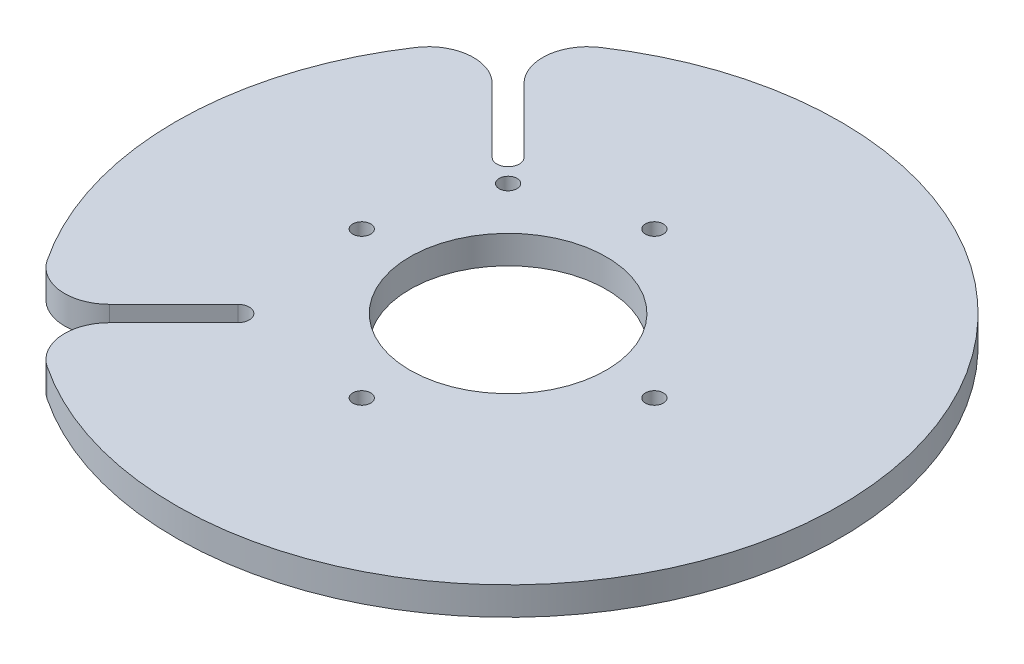
ISO-10303-21;
HEADER;
FILE_DESCRIPTION(('STEP AP214'),'2;1');
FILE_NAME('part.step','',(''),(''),'','','');
FILE_SCHEMA(('AUTOMOTIVE_DESIGN { 1 0 10303 214 1 1 1 1 }'));
ENDSEC;
DATA;
#1=APPLICATION_CONTEXT('core data for automotive mechanical design processes');
#2=APPLICATION_PROTOCOL_DEFINITION('international standard','automotive_design',2000,#1);
#3=PRODUCT_CONTEXT('',#1,'mechanical');
#4=PRODUCT('Part','Part','',(#3));
#5=PRODUCT_RELATED_PRODUCT_CATEGORY('part','',(#4));
#6=PRODUCT_DEFINITION_FORMATION('','',#4);
#7=PRODUCT_DEFINITION_CONTEXT('part definition',#1,'design');
#8=PRODUCT_DEFINITION('design','',#6,#7);
#9=PRODUCT_DEFINITION_SHAPE('','',#8);
#10=(LENGTH_UNIT() NAMED_UNIT(*) SI_UNIT(.MILLI.,.METRE.));
#11=(NAMED_UNIT(*) PLANE_ANGLE_UNIT() SI_UNIT($,.RADIAN.));
#12=(NAMED_UNIT(*) SI_UNIT($,.STERADIAN.) SOLID_ANGLE_UNIT());
#13=UNCERTAINTY_MEASURE_WITH_UNIT(LENGTH_MEASURE(1.E-05),#10,'distance_accuracy_value','');
#14=(GEOMETRIC_REPRESENTATION_CONTEXT(3) GLOBAL_UNCERTAINTY_ASSIGNED_CONTEXT((#13)) GLOBAL_UNIT_ASSIGNED_CONTEXT((#10,
#11,#12)) REPRESENTATION_CONTEXT('',''));
#15=CARTESIAN_POINT('',(0.,0.,0.));
#16=DIRECTION('',(0.,0.,1.));
#17=DIRECTION('',(1.,0.,0.));
#18=AXIS2_PLACEMENT_3D('',#15,#16,#17);
#19=CARTESIAN_POINT('',(0.,6.35,0.));
#20=DIRECTION('',(0.,-1.,0.));
#21=DIRECTION('',(0.,0.,-1.));
#22=AXIS2_PLACEMENT_3D('',#19,#20,#21);
#23=CYLINDRICAL_SURFACE('',#22,75.);
#24=CARTESIAN_POINT('',(0.,6.35,0.));
#25=DIRECTION('',(0.,1.,0.));
#26=DIRECTION('',(0.,0.,1.));
#27=AXIS2_PLACEMENT_3D('',#24,#25,#26);
#28=CIRCLE('',#27,75.);
#29=CARTESIAN_POINT('',(-41.6183838096095,6.35,62.3931897651982));
#30=VERTEX_POINT('',#29);
#31=CARTESIAN_POINT('',(-41.6183838096095,6.35,-62.3931897651982));
#32=VERTEX_POINT('',#31);
#33=EDGE_CURVE('E207',#30,#32,#28,.T.);
#34=ORIENTED_EDGE('',*,*,#33,.F.);
#35=DIRECTION('',(0.,-1.,0.));
#36=VECTOR('',#35,1.);
#37=CARTESIAN_POINT('',(-41.6183838096095,6.35,62.3931897651982));
#38=LINE('',#37,#36);
#39=CARTESIAN_POINT('',(-41.6183838096095,0.,62.3931897651982));
#40=VERTEX_POINT('',#39);
#41=EDGE_CURVE('E224',#30,#40,#38,.T.);
#42=ORIENTED_EDGE('',*,*,#41,.T.);
#43=CARTESIAN_POINT('',(0.,0.,0.));
#44=DIRECTION('',(0.,1.,0.));
#45=DIRECTION('',(0.,0.,1.));
#46=AXIS2_PLACEMENT_3D('',#43,#44,#45);
#47=CIRCLE('',#46,75.);
#48=CARTESIAN_POINT('',(-41.6183838096095,0.,-62.3931897651982));
#49=VERTEX_POINT('',#48);
#50=EDGE_CURVE('E200',#40,#49,#47,.T.);
#51=ORIENTED_EDGE('',*,*,#50,.T.);
#52=DIRECTION('',(0.,-1.,0.));
#53=VECTOR('',#52,1.);
#54=CARTESIAN_POINT('',(-41.6183838096095,6.35,-62.3931897651982));
#55=LINE('',#54,#53);
#56=EDGE_CURVE('E221',#49,#32,#55,.F.);
#57=ORIENTED_EDGE('',*,*,#56,.T.);
#58=EDGE_LOOP('',(#34,#42,#51,#57));
#59=FACE_BOUND('',#58,.T.);
#60=ADVANCED_FACE('F35',(#59),#23,.T.);
#61=CARTESIAN_POINT('',(-62.3931897651982,0.,-41.6183838096095));
#62=VERTEX_POINT('',#61);
#63=CARTESIAN_POINT('',(-62.3931897651982,0.,41.6183838096095));
#64=VERTEX_POINT('',#63);
#65=EDGE_CURVE('E208',#62,#64,#47,.T.);
#66=ORIENTED_EDGE('',*,*,#65,.T.);
#67=DIRECTION('',(0.,-1.,0.));
#68=VECTOR('',#67,1.);
#69=CARTESIAN_POINT('',(-62.3931897651982,6.35,41.6183838096095));
#70=LINE('',#69,#68);
#71=CARTESIAN_POINT('',(-62.3931897651982,6.35,41.6183838096095));
#72=VERTEX_POINT('',#71);
#73=EDGE_CURVE('E235',#64,#72,#70,.F.);
#74=ORIENTED_EDGE('',*,*,#73,.T.);
#75=CARTESIAN_POINT('',(-62.3931897651982,6.35,-41.6183838096095));
#76=VERTEX_POINT('',#75);
#77=EDGE_CURVE('E203',#76,#72,#28,.T.);
#78=ORIENTED_EDGE('',*,*,#77,.F.);
#79=DIRECTION('',(0.,-1.,0.));
#80=VECTOR('',#79,1.);
#81=CARTESIAN_POINT('',(-62.3931897651982,6.35,-41.6183838096095));
#82=LINE('',#81,#80);
#83=EDGE_CURVE('E233',#76,#62,#82,.T.);
#84=ORIENTED_EDGE('',*,*,#83,.T.);
#85=EDGE_LOOP('',(#66,#74,#78,#84));
#86=FACE_BOUND('',#85,.T.);
#87=ADVANCED_FACE('F251',(#86),#23,.T.);
#88=CARTESIAN_POINT('',(0.,6.35,0.));
#89=DIRECTION('',(0.,1.,0.));
#90=DIRECTION('',(0.,0.,1.));
#91=AXIS2_PLACEMENT_3D('',#88,#89,#90);
#92=PLANE('',#91);
#93=DIRECTION('',(0.707106781186547,0.,-0.707106781186548));
#94=VECTOR('',#93,1.);
#95=CARTESIAN_POINT('',(-28.6839487757862,6.35,32.2760512242138));
#96=LINE('',#95,#94);
#97=CARTESIAN_POINT('',(-43.164684979723,6.35,46.7567874281507));
#98=VERTEX_POINT('',#97);
#99=CARTESIAN_POINT('',(-28.6839487757862,6.35,32.2760512242138));
#100=VERTEX_POINT('',#99);
#101=EDGE_CURVE('E161',#98,#100,#96,.T.);
#102=ORIENTED_EDGE('',*,*,#101,.F.);
#103=CARTESIAN_POINT('',(-35.9804800828677,6.35,53.940992325006));
#104=DIRECTION('',(0.,1.,0.));
#105=DIRECTION('',(0.,0.,1.));
#106=AXIS2_PLACEMENT_3D('',#103,#104,#105);
#107=CIRCLE('',#106,10.16);
#108=EDGE_CURVE('E219',#98,#30,#107,.T.);
#109=ORIENTED_EDGE('',*,*,#108,.T.);
#110=ORIENTED_EDGE('',*,*,#33,.T.);
#111=CARTESIAN_POINT('',(-35.9804800828677,6.35,-53.940992325006));
#112=DIRECTION('',(0.,1.,0.));
#113=DIRECTION('',(0.,0.,1.));
#114=AXIS2_PLACEMENT_3D('',#111,#112,#113);
#115=CIRCLE('',#114,10.16);
#116=CARTESIAN_POINT('',(-43.164684979723,6.35,-46.7567874281507));
#117=VERTEX_POINT('',#116);
#118=EDGE_CURVE('E215',#32,#117,#115,.T.);
#119=ORIENTED_EDGE('',*,*,#118,.T.);
#120=DIRECTION('',(-0.707106781186548,0.,-0.707106781186547));
#121=VECTOR('',#120,1.);
#122=CARTESIAN_POINT('',(-28.6839487757862,6.35,-32.2760512242138));
#123=LINE('',#122,#121);
#124=CARTESIAN_POINT('',(-28.6839487757862,6.35,-32.2760512242138));
#125=VERTEX_POINT('',#124);
#126=EDGE_CURVE('E146',#125,#117,#123,.T.);
#127=ORIENTED_EDGE('',*,*,#126,.F.);
#128=CARTESIAN_POINT('',(-30.48,6.35,-30.48));
#129=DIRECTION('',(0.,1.,0.));
#130=DIRECTION('',(0.,0.,1.));
#131=AXIS2_PLACEMENT_3D('',#128,#129,#130);
#132=CIRCLE('',#131,2.54);
#133=CARTESIAN_POINT('',(-32.2760512242138,6.35,-28.6839487757862));
#134=VERTEX_POINT('',#133);
#135=EDGE_CURVE('E132',#134,#125,#132,.T.);
#136=ORIENTED_EDGE('',*,*,#135,.F.);
#137=DIRECTION('',(0.707106781186547,0.,0.707106781186548));
#138=VECTOR('',#137,1.);
#139=CARTESIAN_POINT('',(-32.2760512242138,6.35,-28.6839487757862));
#140=LINE('',#139,#138);
#141=CARTESIAN_POINT('',(-46.7567874281507,6.35,-43.164684979723));
#142=VERTEX_POINT('',#141);
#143=EDGE_CURVE('E144',#142,#134,#140,.T.);
#144=ORIENTED_EDGE('',*,*,#143,.F.);
#145=CARTESIAN_POINT('',(-53.940992325006,6.35,-35.9804800828677));
#146=DIRECTION('',(0.,1.,0.));
#147=DIRECTION('',(0.,0.,1.));
#148=AXIS2_PLACEMENT_3D('',#145,#146,#147);
#149=CIRCLE('',#148,10.16);
#150=EDGE_CURVE('E213',#142,#76,#149,.T.);
#151=ORIENTED_EDGE('',*,*,#150,.T.);
#152=ORIENTED_EDGE('',*,*,#77,.T.);
#153=CARTESIAN_POINT('',(-53.940992325006,6.35,35.9804800828677));
#154=DIRECTION('',(0.,1.,0.));
#155=DIRECTION('',(0.,0.,1.));
#156=AXIS2_PLACEMENT_3D('',#153,#154,#155);
#157=CIRCLE('',#156,10.16);
#158=CARTESIAN_POINT('',(-46.7567874281507,6.35,43.164684979723));
#159=VERTEX_POINT('',#158);
#160=EDGE_CURVE('E217',#72,#159,#157,.T.);
#161=ORIENTED_EDGE('',*,*,#160,.T.);
#162=DIRECTION('',(-0.707106781186547,0.,0.707106781186548));
#163=VECTOR('',#162,1.);
#164=CARTESIAN_POINT('',(-32.2760512242138,6.35,28.6839487757862));
#165=LINE('',#164,#163);
#166=CARTESIAN_POINT('',(-32.2760512242138,6.35,28.6839487757862));
#167=VERTEX_POINT('',#166);
#168=EDGE_CURVE('E170',#167,#159,#165,.T.);
#169=ORIENTED_EDGE('',*,*,#168,.F.);
#170=CARTESIAN_POINT('',(-30.48,6.35,30.48));
#171=DIRECTION('',(0.,1.,0.));
#172=DIRECTION('',(0.,0.,1.));
#173=AXIS2_PLACEMENT_3D('',#170,#171,#172);
#174=CIRCLE('',#173,2.54);
#175=EDGE_CURVE('E167',#100,#167,#174,.T.);
#176=ORIENTED_EDGE('',*,*,#175,.F.);
#177=EDGE_LOOP('',(#102,#109,#110,#119,#127,#136,#144,#151,#152,#161,#169,#176));
#178=FACE_BOUND('',#177,.T.);
#179=CARTESIAN_POINT('',(-25.4,6.35,-25.4));
#180=DIRECTION('',(0.,1.,0.));
#181=DIRECTION('',(0.,0.,1.));
#182=AXIS2_PLACEMENT_3D('',#179,#180,#181);
#183=CIRCLE('',#182,2.0193);
#184=CARTESIAN_POINT('',(-25.4,6.35,-23.3807));
#185=VERTEX_POINT('',#184);
#186=EDGE_CURVE('E149',#185,#185,#183,.T.);
#187=ORIENTED_EDGE('',*,*,#186,.F.);
#188=EDGE_LOOP('',(#187));
#189=FACE_BOUND('',#188,.T.);
#190=CARTESIAN_POINT('',(33.02,6.35,0.));
#191=DIRECTION('',(0.,1.,0.));
#192=DIRECTION('',(0.,0.,1.));
#193=AXIS2_PLACEMENT_3D('',#190,#191,#192);
#194=CIRCLE('',#193,2.0193);
#195=CARTESIAN_POINT('',(33.02,6.35,2.0193));
#196=VERTEX_POINT('',#195);
#197=EDGE_CURVE('E476',#196,#196,#194,.T.);
#198=ORIENTED_EDGE('',*,*,#197,.F.);
#199=EDGE_LOOP('',(#198));
#200=FACE_BOUND('',#199,.T.);
#201=CARTESIAN_POINT('',(0.,6.35,33.02));
#202=DIRECTION('',(0.,1.,0.));
#203=DIRECTION('',(0.,0.,1.));
#204=AXIS2_PLACEMENT_3D('',#201,#202,#203);
#205=CIRCLE('',#204,2.0193);
#206=CARTESIAN_POINT('',(0.,6.35,35.0393));
#207=VERTEX_POINT('',#206);
#208=EDGE_CURVE('E193',#207,#207,#205,.T.);
#209=ORIENTED_EDGE('',*,*,#208,.F.);
#210=EDGE_LOOP('',(#209));
#211=FACE_BOUND('',#210,.T.);
#212=CARTESIAN_POINT('',(-33.02,6.35,0.));
#213=DIRECTION('',(0.,1.,0.));
#214=DIRECTION('',(0.,0.,1.));
#215=AXIS2_PLACEMENT_3D('',#212,#213,#214);
#216=CIRCLE('',#215,2.0193);
#217=CARTESIAN_POINT('',(-33.02,6.35,2.0193));
#218=VERTEX_POINT('',#217);
#219=EDGE_CURVE('E187',#218,#218,#216,.T.);
#220=ORIENTED_EDGE('',*,*,#219,.F.);
#221=EDGE_LOOP('',(#220));
#222=FACE_BOUND('',#221,.T.);
#223=CARTESIAN_POINT('',(0.,6.35,-33.02));
#224=DIRECTION('',(0.,1.,0.));
#225=DIRECTION('',(0.,0.,1.));
#226=AXIS2_PLACEMENT_3D('',#223,#224,#225);
#227=CIRCLE('',#226,2.0193);
#228=CARTESIAN_POINT('',(0.,6.35,-31.0007));
#229=VERTEX_POINT('',#228);
#230=EDGE_CURVE('E181',#229,#229,#227,.T.);
#231=ORIENTED_EDGE('',*,*,#230,.F.);
#232=EDGE_LOOP('',(#231));
#233=FACE_BOUND('',#232,.T.);
#234=CARTESIAN_POINT('',(0.,6.35,0.));
#235=DIRECTION('',(0.,1.,0.));
#236=DIRECTION('',(0.,0.,1.));
#237=AXIS2_PLACEMENT_3D('',#234,#235,#236);
#238=CIRCLE('',#237,22.1615);
#239=CARTESIAN_POINT('',(0.,6.35,22.1615));
#240=VERTEX_POINT('',#239);
#241=EDGE_CURVE('E180',#240,#240,#238,.T.);
#242=ORIENTED_EDGE('',*,*,#241,.F.);
#243=EDGE_LOOP('',(#242));
#244=FACE_BOUND('',#243,.T.);
#245=ADVANCED_FACE('F255',(#178,#189,#200,#211,#222,#233,#244),#92,.T.);
#246=CARTESIAN_POINT('',(0.,0.,0.));
#247=DIRECTION('',(0.,1.,0.));
#248=DIRECTION('',(0.,0.,1.));
#249=AXIS2_PLACEMENT_3D('',#246,#247,#248);
#250=PLANE('',#249);
#251=CARTESIAN_POINT('',(-25.4,0.,-25.4));
#252=DIRECTION('',(0.,1.,0.));
#253=DIRECTION('',(0.,0.,1.));
#254=AXIS2_PLACEMENT_3D('',#251,#252,#253);
#255=CIRCLE('',#254,2.0193);
#256=CARTESIAN_POINT('',(-25.4,0.,-23.3807));
#257=VERTEX_POINT('',#256);
#258=EDGE_CURVE('E478',#257,#257,#255,.T.);
#259=ORIENTED_EDGE('',*,*,#258,.T.);
#260=EDGE_LOOP('',(#259));
#261=FACE_BOUND('',#260,.T.);
#262=CARTESIAN_POINT('',(33.02,0.,0.));
#263=DIRECTION('',(0.,1.,0.));
#264=DIRECTION('',(0.,0.,1.));
#265=AXIS2_PLACEMENT_3D('',#262,#263,#264);
#266=CIRCLE('',#265,2.0193);
#267=CARTESIAN_POINT('',(33.02,0.,2.0193));
#268=VERTEX_POINT('',#267);
#269=EDGE_CURVE('E196',#268,#268,#266,.T.);
#270=ORIENTED_EDGE('',*,*,#269,.T.);
#271=EDGE_LOOP('',(#270));
#272=FACE_BOUND('',#271,.T.);
#273=CARTESIAN_POINT('',(0.,0.,33.02));
#274=DIRECTION('',(0.,1.,0.));
#275=DIRECTION('',(0.,0.,1.));
#276=AXIS2_PLACEMENT_3D('',#273,#274,#275);
#277=CIRCLE('',#276,2.0193);
#278=CARTESIAN_POINT('',(0.,0.,35.0393));
#279=VERTEX_POINT('',#278);
#280=EDGE_CURVE('E190',#279,#279,#277,.T.);
#281=ORIENTED_EDGE('',*,*,#280,.T.);
#282=EDGE_LOOP('',(#281));
#283=FACE_BOUND('',#282,.T.);
#284=CARTESIAN_POINT('',(-33.02,0.,0.));
#285=DIRECTION('',(0.,1.,0.));
#286=DIRECTION('',(0.,0.,1.));
#287=AXIS2_PLACEMENT_3D('',#284,#285,#286);
#288=CIRCLE('',#287,2.0193);
#289=CARTESIAN_POINT('',(-33.02,0.,2.0193));
#290=VERTEX_POINT('',#289);
#291=EDGE_CURVE('E184',#290,#290,#288,.T.);
#292=ORIENTED_EDGE('',*,*,#291,.T.);
#293=EDGE_LOOP('',(#292));
#294=FACE_BOUND('',#293,.T.);
#295=CARTESIAN_POINT('',(0.,0.,-33.02));
#296=DIRECTION('',(0.,1.,0.));
#297=DIRECTION('',(0.,0.,1.));
#298=AXIS2_PLACEMENT_3D('',#295,#296,#297);
#299=CIRCLE('',#298,2.0193);
#300=CARTESIAN_POINT('',(0.,0.,-31.0007));
#301=VERTEX_POINT('',#300);
#302=EDGE_CURVE('E177',#301,#301,#299,.T.);
#303=ORIENTED_EDGE('',*,*,#302,.T.);
#304=EDGE_LOOP('',(#303));
#305=FACE_BOUND('',#304,.T.);
#306=CARTESIAN_POINT('',(0.,0.,0.));
#307=DIRECTION('',(0.,1.,0.));
#308=DIRECTION('',(0.,0.,1.));
#309=AXIS2_PLACEMENT_3D('',#306,#307,#308);
#310=CIRCLE('',#309,22.1615);
#311=CARTESIAN_POINT('',(0.,0.,22.1615));
#312=VERTEX_POINT('',#311);
#313=EDGE_CURVE('E197',#312,#312,#310,.T.);
#314=ORIENTED_EDGE('',*,*,#313,.T.);
#315=EDGE_LOOP('',(#314));
#316=FACE_BOUND('',#315,.T.);
#317=ORIENTED_EDGE('',*,*,#50,.F.);
#318=CARTESIAN_POINT('',(-35.9804800828677,0.,53.940992325006));
#319=DIRECTION('',(0.,1.,0.));
#320=DIRECTION('',(0.,0.,1.));
#321=AXIS2_PLACEMENT_3D('',#318,#319,#320);
#322=CIRCLE('',#321,10.16);
#323=CARTESIAN_POINT('',(-43.164684979723,0.,46.7567874281507));
#324=VERTEX_POINT('',#323);
#325=EDGE_CURVE('E231',#40,#324,#322,.F.);
#326=ORIENTED_EDGE('',*,*,#325,.T.);
#327=DIRECTION('',(0.707106781186547,0.,-0.707106781186548));
#328=VECTOR('',#327,1.);
#329=CARTESIAN_POINT('',(-28.6839487757862,0.,32.2760512242138));
#330=LINE('',#329,#328);
#331=CARTESIAN_POINT('',(-28.6839487757862,0.,32.2760512242138));
#332=VERTEX_POINT('',#331);
#333=EDGE_CURVE('E164',#324,#332,#330,.T.);
#334=ORIENTED_EDGE('',*,*,#333,.T.);
#335=CARTESIAN_POINT('',(-30.48,0.,30.48));
#336=DIRECTION('',(0.,1.,0.));
#337=DIRECTION('',(0.,0.,1.));
#338=AXIS2_PLACEMENT_3D('',#335,#336,#337);
#339=CIRCLE('',#338,2.54);
#340=CARTESIAN_POINT('',(-32.2760512242138,0.,28.6839487757862));
#341=VERTEX_POINT('',#340);
#342=EDGE_CURVE('E157',#332,#341,#339,.T.);
#343=ORIENTED_EDGE('',*,*,#342,.T.);
#344=DIRECTION('',(-0.707106781186547,0.,0.707106781186548));
#345=VECTOR('',#344,1.);
#346=CARTESIAN_POINT('',(-32.2760512242138,0.,28.6839487757862));
#347=LINE('',#346,#345);
#348=CARTESIAN_POINT('',(-46.7567874281507,0.,43.164684979723));
#349=VERTEX_POINT('',#348);
#350=EDGE_CURVE('E160',#341,#349,#347,.T.);
#351=ORIENTED_EDGE('',*,*,#350,.T.);
#352=CARTESIAN_POINT('',(-53.940992325006,0.,35.9804800828677));
#353=DIRECTION('',(0.,1.,0.));
#354=DIRECTION('',(0.,0.,1.));
#355=AXIS2_PLACEMENT_3D('',#352,#353,#354);
#356=CIRCLE('',#355,10.16);
#357=EDGE_CURVE('E229',#349,#64,#356,.F.);
#358=ORIENTED_EDGE('',*,*,#357,.T.);
#359=ORIENTED_EDGE('',*,*,#65,.F.);
#360=CARTESIAN_POINT('',(-53.940992325006,0.,-35.9804800828677));
#361=DIRECTION('',(0.,1.,0.));
#362=DIRECTION('',(0.,0.,1.));
#363=AXIS2_PLACEMENT_3D('',#360,#361,#362);
#364=CIRCLE('',#363,10.16);
#365=CARTESIAN_POINT('',(-46.7567874281507,0.,-43.164684979723));
#366=VERTEX_POINT('',#365);
#367=EDGE_CURVE('E57',#62,#366,#364,.F.);
#368=ORIENTED_EDGE('',*,*,#367,.T.);
#369=DIRECTION('',(0.707106781186547,0.,0.707106781186548));
#370=VECTOR('',#369,1.);
#371=CARTESIAN_POINT('',(-32.2760512242138,0.,-28.6839487757862));
#372=LINE('',#371,#370);
#373=CARTESIAN_POINT('',(-32.2760512242138,0.,-28.6839487757862));
#374=VERTEX_POINT('',#373);
#375=EDGE_CURVE('E135',#366,#374,#372,.T.);
#376=ORIENTED_EDGE('',*,*,#375,.T.);
#377=CARTESIAN_POINT('',(-30.48,0.,-30.48));
#378=DIRECTION('',(0.,1.,0.));
#379=DIRECTION('',(0.,0.,1.));
#380=AXIS2_PLACEMENT_3D('',#377,#378,#379);
#381=CIRCLE('',#380,2.54);
#382=CARTESIAN_POINT('',(-28.6839487757862,0.,-32.2760512242138));
#383=VERTEX_POINT('',#382);
#384=EDGE_CURVE('E130',#374,#383,#381,.T.);
#385=ORIENTED_EDGE('',*,*,#384,.T.);
#386=DIRECTION('',(-0.707106781186548,0.,-0.707106781186547));
#387=VECTOR('',#386,1.);
#388=CARTESIAN_POINT('',(-28.6839487757862,0.,-32.2760512242138));
#389=LINE('',#388,#387);
#390=CARTESIAN_POINT('',(-43.164684979723,0.,-46.7567874281507));
#391=VERTEX_POINT('',#390);
#392=EDGE_CURVE('E137',#383,#391,#389,.T.);
#393=ORIENTED_EDGE('',*,*,#392,.T.);
#394=CARTESIAN_POINT('',(-35.9804800828677,0.,-53.940992325006));
#395=DIRECTION('',(0.,1.,0.));
#396=DIRECTION('',(0.,0.,1.));
#397=AXIS2_PLACEMENT_3D('',#394,#395,#396);
#398=CIRCLE('',#397,10.16);
#399=EDGE_CURVE('E227',#391,#49,#398,.F.);
#400=ORIENTED_EDGE('',*,*,#399,.T.);
#401=EDGE_LOOP('',(#317,#326,#334,#343,#351,#358,#359,#368,#376,#385,#393,#400));
#402=FACE_BOUND('',#401,.T.);
#403=ADVANCED_FACE('F142',(#261,#272,#283,#294,#305,#316,#402),#250,.F.);
#404=CARTESIAN_POINT('',(0.,0.,0.));
#405=DIRECTION('',(0.,1.,0.));
#406=DIRECTION('',(0.,0.,1.));
#407=AXIS2_PLACEMENT_3D('',#404,#405,#406);
#408=CYLINDRICAL_SURFACE('',#407,22.1615);
#409=ORIENTED_EDGE('',*,*,#313,.F.);
#410=EDGE_LOOP('',(#409));
#411=FACE_BOUND('',#410,.T.);
#412=ORIENTED_EDGE('',*,*,#241,.T.);
#413=EDGE_LOOP('',(#412));
#414=FACE_BOUND('',#413,.T.);
#415=ADVANCED_FACE('F363',(#411,#414),#408,.F.);
#416=CARTESIAN_POINT('',(0.,0.,-33.02));
#417=DIRECTION('',(0.,1.,0.));
#418=DIRECTION('',(0.,0.,1.));
#419=AXIS2_PLACEMENT_3D('',#416,#417,#418);
#420=CYLINDRICAL_SURFACE('',#419,2.0193);
#421=ORIENTED_EDGE('',*,*,#302,.F.);
#422=EDGE_LOOP('',(#421));
#423=FACE_BOUND('',#422,.T.);
#424=ORIENTED_EDGE('',*,*,#230,.T.);
#425=EDGE_LOOP('',(#424));
#426=FACE_BOUND('',#425,.T.);
#427=ADVANCED_FACE('F431',(#423,#426),#420,.F.);
#428=CARTESIAN_POINT('',(-33.02,0.,0.));
#429=DIRECTION('',(0.,1.,0.));
#430=DIRECTION('',(0.,0.,1.));
#431=AXIS2_PLACEMENT_3D('',#428,#429,#430);
#432=CYLINDRICAL_SURFACE('',#431,2.0193);
#433=ORIENTED_EDGE('',*,*,#291,.F.);
#434=EDGE_LOOP('',(#433));
#435=FACE_BOUND('',#434,.T.);
#436=ORIENTED_EDGE('',*,*,#219,.T.);
#437=EDGE_LOOP('',(#436));
#438=FACE_BOUND('',#437,.T.);
#439=ADVANCED_FACE('F421',(#435,#438),#432,.F.);
#440=CARTESIAN_POINT('',(0.,0.,33.02));
#441=DIRECTION('',(0.,1.,0.));
#442=DIRECTION('',(0.,0.,1.));
#443=AXIS2_PLACEMENT_3D('',#440,#441,#442);
#444=CYLINDRICAL_SURFACE('',#443,2.0193);
#445=ORIENTED_EDGE('',*,*,#280,.F.);
#446=EDGE_LOOP('',(#445));
#447=FACE_BOUND('',#446,.T.);
#448=ORIENTED_EDGE('',*,*,#208,.T.);
#449=EDGE_LOOP('',(#448));
#450=FACE_BOUND('',#449,.T.);
#451=ADVANCED_FACE('F411',(#447,#450),#444,.F.);
#452=CARTESIAN_POINT('',(33.02,0.,0.));
#453=DIRECTION('',(0.,1.,0.));
#454=DIRECTION('',(0.,0.,1.));
#455=AXIS2_PLACEMENT_3D('',#452,#453,#454);
#456=CYLINDRICAL_SURFACE('',#455,2.0193);
#457=ORIENTED_EDGE('',*,*,#269,.F.);
#458=EDGE_LOOP('',(#457));
#459=FACE_BOUND('',#458,.T.);
#460=ORIENTED_EDGE('',*,*,#197,.T.);
#461=EDGE_LOOP('',(#460));
#462=FACE_BOUND('',#461,.T.);
#463=ADVANCED_FACE('F401',(#459,#462),#456,.F.);
#464=CARTESIAN_POINT('',(-25.4,0.,-25.4));
#465=DIRECTION('',(0.,1.,0.));
#466=DIRECTION('',(0.,0.,1.));
#467=AXIS2_PLACEMENT_3D('',#464,#465,#466);
#468=CYLINDRICAL_SURFACE('',#467,2.0193);
#469=ORIENTED_EDGE('',*,*,#258,.F.);
#470=EDGE_LOOP('',(#469));
#471=FACE_BOUND('',#470,.T.);
#472=ORIENTED_EDGE('',*,*,#186,.T.);
#473=EDGE_LOOP('',(#472));
#474=FACE_BOUND('',#473,.T.);
#475=ADVANCED_FACE('F392',(#471,#474),#468,.F.);
#476=CARTESIAN_POINT('',(-30.48,0.,-30.48));
#477=DIRECTION('',(0.,1.,0.));
#478=DIRECTION('',(0.,0.,1.));
#479=AXIS2_PLACEMENT_3D('',#476,#477,#478);
#480=CYLINDRICAL_SURFACE('',#479,2.54);
#481=ORIENTED_EDGE('',*,*,#135,.T.);
#482=DIRECTION('',(0.,1.,0.));
#483=VECTOR('',#482,1.);
#484=CARTESIAN_POINT('',(-28.6839487757862,0.,-32.2760512242138));
#485=LINE('',#484,#483);
#486=EDGE_CURVE('E126',#383,#125,#485,.T.);
#487=ORIENTED_EDGE('',*,*,#486,.F.);
#488=ORIENTED_EDGE('',*,*,#384,.F.);
#489=DIRECTION('',(0.,1.,0.));
#490=VECTOR('',#489,1.);
#491=CARTESIAN_POINT('',(-32.2760512242138,0.,-28.6839487757862));
#492=LINE('',#491,#490);
#493=EDGE_CURVE('E134',#374,#134,#492,.T.);
#494=ORIENTED_EDGE('',*,*,#493,.T.);
#495=EDGE_LOOP('',(#481,#487,#488,#494));
#496=FACE_BOUND('',#495,.T.);
#497=ADVANCED_FACE('F127',(#496),#480,.F.);
#498=CARTESIAN_POINT('',(-32.2760512242138,0.,-28.6839487757862));
#499=DIRECTION('',(-0.707106781186548,0.,0.707106781186547));
#500=DIRECTION('',(0.707106781186547,0.,0.707106781186548));
#501=AXIS2_PLACEMENT_3D('',#498,#499,#500);
#502=PLANE('',#501);
#503=ORIENTED_EDGE('',*,*,#375,.F.);
#504=DIRECTION('',(0.,-1.,0.));
#505=VECTOR('',#504,1.);
#506=CARTESIAN_POINT('',(-46.7567874281507,0.,-43.164684979723));
#507=LINE('',#506,#505);
#508=EDGE_CURVE('E11',#366,#142,#507,.F.);
#509=ORIENTED_EDGE('',*,*,#508,.T.);
#510=ORIENTED_EDGE('',*,*,#143,.T.);
#511=ORIENTED_EDGE('',*,*,#493,.F.);
#512=EDGE_LOOP('',(#503,#509,#510,#511));
#513=FACE_BOUND('',#512,.T.);
#514=ADVANCED_FACE('F261',(#513),#502,.F.);
#515=CARTESIAN_POINT('',(-28.6839487757862,0.,-32.2760512242138));
#516=DIRECTION('',(0.707106781186547,0.,-0.707106781186548));
#517=DIRECTION('',(-0.707106781186548,0.,-0.707106781186547));
#518=AXIS2_PLACEMENT_3D('',#515,#516,#517);
#519=PLANE('',#518);
#520=ORIENTED_EDGE('',*,*,#126,.T.);
#521=DIRECTION('',(0.,-1.,0.));
#522=VECTOR('',#521,1.);
#523=CARTESIAN_POINT('',(-43.164684979723,0.,-46.7567874281507));
#524=LINE('',#523,#522);
#525=EDGE_CURVE('E43',#117,#391,#524,.T.);
#526=ORIENTED_EDGE('',*,*,#525,.T.);
#527=ORIENTED_EDGE('',*,*,#392,.F.);
#528=ORIENTED_EDGE('',*,*,#486,.T.);
#529=EDGE_LOOP('',(#520,#526,#527,#528));
#530=FACE_BOUND('',#529,.T.);
#531=ADVANCED_FACE('F138',(#530),#519,.F.);
#532=CARTESIAN_POINT('',(-30.48,0.,30.48));
#533=DIRECTION('',(0.,1.,0.));
#534=DIRECTION('',(0.,0.,1.));
#535=AXIS2_PLACEMENT_3D('',#532,#533,#534);
#536=CYLINDRICAL_SURFACE('',#535,2.54);
#537=ORIENTED_EDGE('',*,*,#175,.T.);
#538=DIRECTION('',(0.,1.,0.));
#539=VECTOR('',#538,1.);
#540=CARTESIAN_POINT('',(-32.2760512242138,0.,28.6839487757862));
#541=LINE('',#540,#539);
#542=EDGE_CURVE('E166',#341,#167,#541,.T.);
#543=ORIENTED_EDGE('',*,*,#542,.F.);
#544=ORIENTED_EDGE('',*,*,#342,.F.);
#545=DIRECTION('',(0.,1.,0.));
#546=VECTOR('',#545,1.);
#547=CARTESIAN_POINT('',(-28.6839487757862,0.,32.2760512242138));
#548=LINE('',#547,#546);
#549=EDGE_CURVE('E154',#332,#100,#548,.T.);
#550=ORIENTED_EDGE('',*,*,#549,.T.);
#551=EDGE_LOOP('',(#537,#543,#544,#550));
#552=FACE_BOUND('',#551,.T.);
#553=ADVANCED_FACE('F280',(#552),#536,.F.);
#554=CARTESIAN_POINT('',(-28.6839487757862,0.,32.2760512242138));
#555=DIRECTION('',(0.707106781186548,0.,0.707106781186547));
#556=DIRECTION('',(0.707106781186547,0.,-0.707106781186548));
#557=AXIS2_PLACEMENT_3D('',#554,#555,#556);
#558=PLANE('',#557);
#559=ORIENTED_EDGE('',*,*,#333,.F.);
#560=DIRECTION('',(0.,-1.,0.));
#561=VECTOR('',#560,1.);
#562=CARTESIAN_POINT('',(-43.164684979723,0.,46.7567874281507));
#563=LINE('',#562,#561);
#564=EDGE_CURVE('E206',#324,#98,#563,.F.);
#565=ORIENTED_EDGE('',*,*,#564,.T.);
#566=ORIENTED_EDGE('',*,*,#101,.T.);
#567=ORIENTED_EDGE('',*,*,#549,.F.);
#568=EDGE_LOOP('',(#559,#565,#566,#567));
#569=FACE_BOUND('',#568,.T.);
#570=ADVANCED_FACE('F277',(#569),#558,.F.);
#571=CARTESIAN_POINT('',(-32.2760512242138,0.,28.6839487757862));
#572=DIRECTION('',(-0.707106781186548,0.,-0.707106781186547));
#573=DIRECTION('',(-0.707106781186547,0.,0.707106781186548));
#574=AXIS2_PLACEMENT_3D('',#571,#572,#573);
#575=PLANE('',#574);
#576=ORIENTED_EDGE('',*,*,#168,.T.);
#577=DIRECTION('',(0.,-1.,0.));
#578=VECTOR('',#577,1.);
#579=CARTESIAN_POINT('',(-46.7567874281507,0.,43.164684979723));
#580=LINE('',#579,#578);
#581=EDGE_CURVE('E238',#159,#349,#580,.T.);
#582=ORIENTED_EDGE('',*,*,#581,.T.);
#583=ORIENTED_EDGE('',*,*,#350,.F.);
#584=ORIENTED_EDGE('',*,*,#542,.T.);
#585=EDGE_LOOP('',(#576,#582,#583,#584));
#586=FACE_BOUND('',#585,.T.);
#587=ADVANCED_FACE('F242',(#586),#575,.F.);
#588=CARTESIAN_POINT('',(-35.9804800828677,6.35,53.940992325006));
#589=DIRECTION('',(0.,-1.,0.));
#590=DIRECTION('',(0.,0.,-1.));
#591=AXIS2_PLACEMENT_3D('',#588,#589,#590);
#592=CYLINDRICAL_SURFACE('',#591,10.16);
#593=ORIENTED_EDGE('',*,*,#325,.F.);
#594=ORIENTED_EDGE('',*,*,#41,.F.);
#595=ORIENTED_EDGE('',*,*,#108,.F.);
#596=ORIENTED_EDGE('',*,*,#564,.F.);
#597=EDGE_LOOP('',(#593,#594,#595,#596));
#598=FACE_BOUND('',#597,.T.);
#599=ADVANCED_FACE('F272',(#598),#592,.T.);
#600=CARTESIAN_POINT('',(-53.940992325006,6.35,35.9804800828677));
#601=DIRECTION('',(0.,-1.,0.));
#602=DIRECTION('',(0.,0.,-1.));
#603=AXIS2_PLACEMENT_3D('',#600,#601,#602);
#604=CYLINDRICAL_SURFACE('',#603,10.16);
#605=ORIENTED_EDGE('',*,*,#357,.F.);
#606=ORIENTED_EDGE('',*,*,#581,.F.);
#607=ORIENTED_EDGE('',*,*,#160,.F.);
#608=ORIENTED_EDGE('',*,*,#73,.F.);
#609=EDGE_LOOP('',(#605,#606,#607,#608));
#610=FACE_BOUND('',#609,.T.);
#611=ADVANCED_FACE('F248',(#610),#604,.T.);
#612=CARTESIAN_POINT('',(-35.9804800828677,6.35,-53.940992325006));
#613=DIRECTION('',(0.,-1.,0.));
#614=DIRECTION('',(0.,0.,-1.));
#615=AXIS2_PLACEMENT_3D('',#612,#613,#614);
#616=CYLINDRICAL_SURFACE('',#615,10.16);
#617=ORIENTED_EDGE('',*,*,#399,.F.);
#618=ORIENTED_EDGE('',*,*,#525,.F.);
#619=ORIENTED_EDGE('',*,*,#118,.F.);
#620=ORIENTED_EDGE('',*,*,#56,.F.);
#621=EDGE_LOOP('',(#617,#618,#619,#620));
#622=FACE_BOUND('',#621,.T.);
#623=ADVANCED_FACE('F264',(#622),#616,.T.);
#624=CARTESIAN_POINT('',(-53.940992325006,6.35,-35.9804800828677));
#625=DIRECTION('',(0.,-1.,0.));
#626=DIRECTION('',(0.,0.,-1.));
#627=AXIS2_PLACEMENT_3D('',#624,#625,#626);
#628=CYLINDRICAL_SURFACE('',#627,10.16);
#629=ORIENTED_EDGE('',*,*,#367,.F.);
#630=ORIENTED_EDGE('',*,*,#83,.F.);
#631=ORIENTED_EDGE('',*,*,#150,.F.);
#632=ORIENTED_EDGE('',*,*,#508,.F.);
#633=EDGE_LOOP('',(#629,#630,#631,#632));
#634=FACE_BOUND('',#633,.T.);
#635=ADVANCED_FACE('F37',(#634),#628,.T.);
#636=CLOSED_SHELL('',(#60,#87,#245,#403,#415,#427,#439,#451,#463,#475,#497,#514,#531,#553,#570,
#587,#599,#611,#623,#635));
#637=MANIFOLD_SOLID_BREP('B2',#636);
#638=ADVANCED_BREP_SHAPE_REPRESENTATION('',(#18,#637),#14);
#639=SHAPE_DEFINITION_REPRESENTATION(#9,#638);
ENDSEC;
END-ISO-10303-21;
